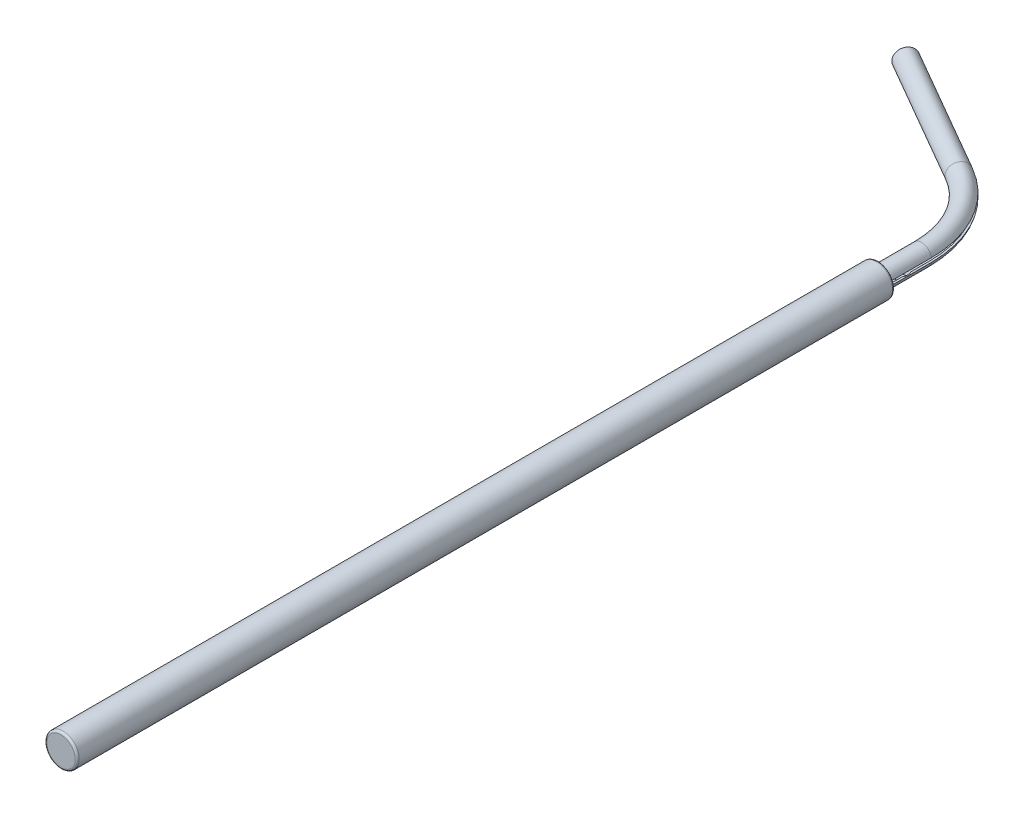
ISO-10303-21;
HEADER;
FILE_DESCRIPTION(('STEP AP214'),'2;1');
FILE_NAME('part.step','',(''),(''),'','','');
FILE_SCHEMA(('AUTOMOTIVE_DESIGN { 1 0 10303 214 1 1 1 1 }'));
ENDSEC;
DATA;
#1=APPLICATION_CONTEXT('core data for automotive mechanical design processes');
#2=APPLICATION_PROTOCOL_DEFINITION('international standard','automotive_design',2000,#1);
#3=PRODUCT_CONTEXT('',#1,'mechanical');
#4=PRODUCT('Part','Part','',(#3));
#5=PRODUCT_RELATED_PRODUCT_CATEGORY('part','',(#4));
#6=PRODUCT_DEFINITION_FORMATION('','',#4);
#7=PRODUCT_DEFINITION_CONTEXT('part definition',#1,'design');
#8=PRODUCT_DEFINITION('design','',#6,#7);
#9=PRODUCT_DEFINITION_SHAPE('','',#8);
#10=(LENGTH_UNIT() NAMED_UNIT(*) SI_UNIT(.MILLI.,.METRE.));
#11=(NAMED_UNIT(*) PLANE_ANGLE_UNIT() SI_UNIT($,.RADIAN.));
#12=(NAMED_UNIT(*) SI_UNIT($,.STERADIAN.) SOLID_ANGLE_UNIT());
#13=UNCERTAINTY_MEASURE_WITH_UNIT(LENGTH_MEASURE(1.E-05),#10,'distance_accuracy_value','');
#14=(GEOMETRIC_REPRESENTATION_CONTEXT(3) GLOBAL_UNCERTAINTY_ASSIGNED_CONTEXT((#13)) GLOBAL_UNIT_ASSIGNED_CONTEXT((#10,
#11,#12)) REPRESENTATION_CONTEXT('',''));
#15=CARTESIAN_POINT('',(0.,0.,0.));
#16=DIRECTION('',(0.,0.,1.));
#17=DIRECTION('',(1.,0.,0.));
#18=AXIS2_PLACEMENT_3D('',#15,#16,#17);
#19=CARTESIAN_POINT('',(0.,0.,-210.566243270259));
#20=DIRECTION('',(0.,0.,1.));
#21=DIRECTION('',(1.,0.,0.));
#22=AXIS2_PLACEMENT_3D('',#19,#20,#21);
#23=CYLINDRICAL_SURFACE('',#22,2.);
#24=DIRECTION('',(0.,0.,1.));
#25=VECTOR('',#24,1.);
#26=CARTESIAN_POINT('',(1.93649167310371,-0.499999999999999,-210.566243270259));
#27=LINE('',#26,#25);
#28=CARTESIAN_POINT('',(1.93649167310371,-0.5,-203.969223593596));
#29=VERTEX_POINT('',#28);
#30=CARTESIAN_POINT('',(1.93649167310371,-0.5,-200.));
#31=VERTEX_POINT('',#30);
#32=EDGE_CURVE('E127',#29,#31,#27,.T.);
#33=ORIENTED_EDGE('',*,*,#32,.F.);
#34=CARTESIAN_POINT('',(0.,0.,-203.969223593596));
#35=DIRECTION('',(0.,0.,-1.00000000000001));
#36=DIRECTION('',(-1.,0.,0.));
#37=AXIS2_PLACEMENT_3D('',#34,#35,#36);
#38=CIRCLE('',#37,2.);
#39=CARTESIAN_POINT('',(1.93649167310371,0.5,-203.969223593596));
#40=VERTEX_POINT('',#39);
#41=EDGE_CURVE('E47',#29,#40,#38,.T.);
#42=ORIENTED_EDGE('',*,*,#41,.T.);
#43=DIRECTION('',(0.,0.,1.));
#44=VECTOR('',#43,1.);
#45=CARTESIAN_POINT('',(1.93649167310371,0.5,-210.566243270259));
#46=LINE('',#45,#44);
#47=CARTESIAN_POINT('',(1.93649167310371,0.5,-200.));
#48=VERTEX_POINT('',#47);
#49=EDGE_CURVE('E126',#40,#48,#46,.T.);
#50=ORIENTED_EDGE('',*,*,#49,.T.);
#51=CARTESIAN_POINT('',(0.,0.,-200.));
#52=DIRECTION('',(0.,0.,1.));
#53=DIRECTION('',(-1.,0.,0.));
#54=AXIS2_PLACEMENT_3D('',#51,#52,#53);
#55=CIRCLE('',#54,2.);
#56=EDGE_CURVE('E262',#48,#31,#55,.T.);
#57=ORIENTED_EDGE('',*,*,#56,.T.);
#58=EDGE_LOOP('',(#33,#42,#50,#57));
#59=FACE_BOUND('',#58,.T.);
#60=ADVANCED_FACE('F32',(#59),#23,.F.);
#61=CARTESIAN_POINT('',(0.,0.,-200.));
#62=DIRECTION('',(0.,0.,1.));
#63=DIRECTION('',(1.,0.,0.));
#64=AXIS2_PLACEMENT_3D('',#61,#62,#63);
#65=PLANE('',#64);
#66=CARTESIAN_POINT('',(0.,0.,-200.));
#67=DIRECTION('',(0.,0.,1.));
#68=DIRECTION('',(1.,0.,0.));
#69=AXIS2_PLACEMENT_3D('',#66,#67,#68);
#70=CIRCLE('',#69,3.46075);
#71=CARTESIAN_POINT('',(3.46075,0.,-200.));
#72=VERTEX_POINT('',#71);
#73=EDGE_CURVE('E40',#72,#72,#70,.F.);
#74=ORIENTED_EDGE('',*,*,#73,.T.);
#75=EDGE_LOOP('',(#74));
#76=FACE_BOUND('',#75,.T.);
#77=CARTESIAN_POINT('',(0.,0.,-200.));
#78=DIRECTION('',(0.,0.,-1.));
#79=DIRECTION('',(-1.,0.,0.));
#80=AXIS2_PLACEMENT_3D('',#77,#78,#79);
#81=CIRCLE('',#80,2.5);
#82=CARTESIAN_POINT('',(2.44948974278318,-0.5,-200.));
#83=VERTEX_POINT('',#82);
#84=CARTESIAN_POINT('',(2.44948974278318,0.5,-200.));
#85=VERTEX_POINT('',#84);
#86=EDGE_CURVE('E54',#83,#85,#81,.T.);
#87=ORIENTED_EDGE('',*,*,#86,.F.);
#88=DIRECTION('',(1.,0.,0.));
#89=VECTOR('',#88,1.);
#90=CARTESIAN_POINT('',(1.93649167310371,-0.5,-200.));
#91=LINE('',#90,#89);
#92=EDGE_CURVE('E253',#31,#83,#91,.T.);
#93=ORIENTED_EDGE('',*,*,#92,.F.);
#94=ORIENTED_EDGE('',*,*,#56,.F.);
#95=DIRECTION('',(-1.,0.,0.));
#96=VECTOR('',#95,1.);
#97=CARTESIAN_POINT('',(2.44948974278318,0.5,-200.));
#98=LINE('',#97,#96);
#99=EDGE_CURVE('E258',#85,#48,#98,.T.);
#100=ORIENTED_EDGE('',*,*,#99,.F.);
#101=EDGE_LOOP('',(#87,#93,#94,#100));
#102=FACE_BOUND('',#101,.T.);
#103=ADVANCED_FACE('F188',(#76,#102),#65,.F.);
#104=CARTESIAN_POINT('',(0.,0.,-200.));
#105=DIRECTION('',(0.,0.,1.));
#106=DIRECTION('',(1.,0.,0.));
#107=AXIS2_PLACEMENT_3D('',#104,#105,#106);
#108=CYLINDRICAL_SURFACE('',#107,3.96875);
#109=CARTESIAN_POINT('',(0.,0.,-0.508000000000008));
#110=DIRECTION('',(0.,0.,1.));
#111=DIRECTION('',(1.,0.,0.));
#112=AXIS2_PLACEMENT_3D('',#109,#110,#111);
#113=CIRCLE('',#112,3.96875);
#114=CARTESIAN_POINT('',(3.96875,0.,-0.508000000000008));
#115=VERTEX_POINT('',#114);
#116=EDGE_CURVE('E183',#115,#115,#113,.F.);
#117=ORIENTED_EDGE('',*,*,#116,.T.);
#118=EDGE_LOOP('',(#117));
#119=FACE_BOUND('',#118,.T.);
#120=CARTESIAN_POINT('',(0.,0.,-199.492));
#121=DIRECTION('',(0.,0.,1.));
#122=DIRECTION('',(1.,0.,0.));
#123=AXIS2_PLACEMENT_3D('',#120,#121,#122);
#124=CIRCLE('',#123,3.96875);
#125=CARTESIAN_POINT('',(3.96875,0.,-199.492));
#126=VERTEX_POINT('',#125);
#127=EDGE_CURVE('E180',#126,#126,#124,.T.);
#128=ORIENTED_EDGE('',*,*,#127,.T.);
#129=EDGE_LOOP('',(#128));
#130=FACE_BOUND('',#129,.T.);
#131=ADVANCED_FACE('F196',(#119,#130),#108,.T.);
#132=CARTESIAN_POINT('',(0.,0.,0.));
#133=DIRECTION('',(0.,0.,1.));
#134=DIRECTION('',(1.,0.,0.));
#135=AXIS2_PLACEMENT_3D('',#132,#133,#134);
#136=PLANE('',#135);
#137=CARTESIAN_POINT('',(0.,0.,0.));
#138=DIRECTION('',(0.,0.,1.));
#139=DIRECTION('',(1.,0.,0.));
#140=AXIS2_PLACEMENT_3D('',#137,#138,#139);
#141=CIRCLE('',#140,3.46075);
#142=CARTESIAN_POINT('',(3.46075,0.,0.));
#143=VERTEX_POINT('',#142);
#144=EDGE_CURVE('E177',#143,#143,#141,.T.);
#145=ORIENTED_EDGE('',*,*,#144,.T.);
#146=EDGE_LOOP('',(#145));
#147=FACE_BOUND('',#146,.T.);
#148=ADVANCED_FACE('F198',(#147),#136,.T.);
#149=CARTESIAN_POINT('',(0.,0.,-0.508000000000008));
#150=DIRECTION('',(0.,0.,1.));
#151=DIRECTION('',(1.,0.,0.));
#152=AXIS2_PLACEMENT_3D('',#149,#150,#151);
#153=TOROIDAL_SURFACE('',#152,3.46075,0.508);
#154=ORIENTED_EDGE('',*,*,#116,.F.);
#155=EDGE_LOOP('',(#154));
#156=FACE_BOUND('',#155,.T.);
#157=ORIENTED_EDGE('',*,*,#144,.F.);
#158=EDGE_LOOP('',(#157));
#159=FACE_BOUND('',#158,.T.);
#160=ADVANCED_FACE('F193',(#156,#159),#153,.T.);
#161=CARTESIAN_POINT('',(0.,0.,-199.492));
#162=DIRECTION('',(0.,0.,1.));
#163=DIRECTION('',(1.,0.,0.));
#164=AXIS2_PLACEMENT_3D('',#161,#162,#163);
#165=TOROIDAL_SURFACE('',#164,3.46075,0.508);
#166=ORIENTED_EDGE('',*,*,#73,.F.);
#167=EDGE_LOOP('',(#166));
#168=FACE_BOUND('',#167,.T.);
#169=ORIENTED_EDGE('',*,*,#127,.F.);
#170=EDGE_LOOP('',(#169));
#171=FACE_BOUND('',#170,.T.);
#172=ADVANCED_FACE('F34',(#168,#171),#165,.T.);
#173=CARTESIAN_POINT('',(-12.5,0.,-232.21687836487));
#174=DIRECTION('',(-0.866025403784439,0.,-0.499999999999998));
#175=DIRECTION('',(-0.499999999999999,0.,0.86602540378444));
#176=AXIS2_PLACEMENT_3D('',#173,#174,#175);
#177=CYLINDRICAL_SURFACE('',#176,2.);
#178=CARTESIAN_POINT('',(-12.5,0.,-232.21687836487));
#179=DIRECTION('',(0.86602540378444,0.,0.499999999999998));
#180=DIRECTION('',(-0.499999999999998,0.,0.86602540378444));
#181=AXIS2_PLACEMENT_3D('',#178,#179,#180);
#182=CIRCLE('',#181,2.);
#183=CARTESIAN_POINT('',(-11.5317541634482,0.5,-233.893929347995));
#184=VERTEX_POINT('',#183);
#185=CARTESIAN_POINT('',(-11.5317541634482,-0.499999999999999,-233.893929347995));
#186=VERTEX_POINT('',#185);
#187=EDGE_CURVE('E140',#184,#186,#182,.T.);
#188=ORIENTED_EDGE('',*,*,#187,.T.);
#189=DIRECTION('',(-0.866025403784439,0.,-0.499999999999998));
#190=VECTOR('',#189,1.);
#191=CARTESIAN_POINT('',(-11.5317541634482,-0.499999999999999,-233.893929347995));
#192=LINE('',#191,#190);
#193=CARTESIAN_POINT('',(-42.3330243526703,-0.499999999999999,-251.677050983125));
#194=VERTEX_POINT('',#193);
#195=EDGE_CURVE('E168',#186,#194,#192,.T.);
#196=ORIENTED_EDGE('',*,*,#195,.T.);
#197=CARTESIAN_POINT('',(-43.3012701892222,0.,-250.));
#198=DIRECTION('',(0.86602540378444,0.,0.499999999999998));
#199=DIRECTION('',(-0.499999999999998,0.,0.86602540378444));
#200=AXIS2_PLACEMENT_3D('',#197,#198,#199);
#201=CIRCLE('',#200,2.);
#202=CARTESIAN_POINT('',(-42.3330243526703,0.5,-251.677050983125));
#203=VERTEX_POINT('',#202);
#204=EDGE_CURVE('E159',#203,#194,#201,.T.);
#205=ORIENTED_EDGE('',*,*,#204,.F.);
#206=DIRECTION('',(-0.866025403784439,0.,-0.499999999999998));
#207=VECTOR('',#206,1.);
#208=CARTESIAN_POINT('',(-11.5317541634482,0.5,-233.893929347995));
#209=LINE('',#208,#207);
#210=EDGE_CURVE('E171',#184,#203,#209,.T.);
#211=ORIENTED_EDGE('',*,*,#210,.F.);
#212=EDGE_LOOP('',(#188,#196,#205,#211));
#213=FACE_BOUND('',#212,.T.);
#214=ADVANCED_FACE('F192',(#213),#177,.F.);
#215=CARTESIAN_POINT('',(-12.5,0.,-232.21687836487));
#216=DIRECTION('',(-0.866025403784439,0.,-0.499999999999998));
#217=DIRECTION('',(-0.499999999999999,0.,0.86602540378444));
#218=AXIS2_PLACEMENT_3D('',#215,#216,#217);
#219=CYLINDRICAL_SURFACE('',#218,2.5);
#220=CARTESIAN_POINT('',(-12.5,0.,-232.21687836487));
#221=DIRECTION('',(-0.86602540378444,0.,-0.499999999999998));
#222=DIRECTION('',(-0.499999999999998,0.,0.86602540378444));
#223=AXIS2_PLACEMENT_3D('',#220,#221,#222);
#224=CIRCLE('',#223,2.5);
#225=CARTESIAN_POINT('',(-11.2752551286084,-0.5,-234.33819870843));
#226=VERTEX_POINT('',#225);
#227=CARTESIAN_POINT('',(-11.2752551286084,0.5,-234.33819870843));
#228=VERTEX_POINT('',#227);
#229=EDGE_CURVE('E137',#226,#228,#224,.T.);
#230=ORIENTED_EDGE('',*,*,#229,.T.);
#231=DIRECTION('',(-0.866025403784439,0.,-0.499999999999998));
#232=VECTOR('',#231,1.);
#233=CARTESIAN_POINT('',(-11.2752551286084,0.5,-234.33819870843));
#234=LINE('',#233,#232);
#235=CARTESIAN_POINT('',(-42.0765253178306,0.5,-252.12132034356));
#236=VERTEX_POINT('',#235);
#237=EDGE_CURVE('E174',#228,#236,#234,.T.);
#238=ORIENTED_EDGE('',*,*,#237,.T.);
#239=CARTESIAN_POINT('',(-43.3012701892222,0.,-250.));
#240=DIRECTION('',(-0.86602540378444,0.,-0.499999999999998));
#241=DIRECTION('',(-0.499999999999998,0.,0.86602540378444));
#242=AXIS2_PLACEMENT_3D('',#239,#240,#241);
#243=CIRCLE('',#242,2.5);
#244=CARTESIAN_POINT('',(-42.0765253178306,-0.5,-252.12132034356));
#245=VERTEX_POINT('',#244);
#246=EDGE_CURVE('E153',#245,#236,#243,.T.);
#247=ORIENTED_EDGE('',*,*,#246,.F.);
#248=DIRECTION('',(-0.866025403784439,0.,-0.499999999999998));
#249=VECTOR('',#248,1.);
#250=CARTESIAN_POINT('',(-11.2752551286084,-0.5,-234.33819870843));
#251=LINE('',#250,#249);
#252=EDGE_CURVE('E165',#226,#245,#251,.T.);
#253=ORIENTED_EDGE('',*,*,#252,.F.);
#254=EDGE_LOOP('',(#230,#238,#247,#253));
#255=FACE_BOUND('',#254,.T.);
#256=ADVANCED_FACE('F238',(#255),#219,.T.);
#257=CARTESIAN_POINT('',(-25.,0.,-210.566243270259));
#258=DIRECTION('',(0.,1.,0.));
#259=DIRECTION('',(0.,0.,1.));
#260=AXIS2_PLACEMENT_3D('',#257,#258,#259);
#261=TOROIDAL_SURFACE('',#260,25.,2.);
#262=CARTESIAN_POINT('',(0.,0.,-210.566243270259));
#263=DIRECTION('',(0.,0.,1.));
#264=DIRECTION('',(-1.,0.,0.));
#265=AXIS2_PLACEMENT_3D('',#262,#263,#264);
#266=CIRCLE('',#265,2.);
#267=CARTESIAN_POINT('',(1.93649167310371,0.5,-210.566243270259));
#268=VERTEX_POINT('',#267);
#269=CARTESIAN_POINT('',(1.93649167310371,-0.499999999999999,-210.566243270259));
#270=VERTEX_POINT('',#269);
#271=EDGE_CURVE('E248',#268,#270,#266,.T.);
#272=ORIENTED_EDGE('',*,*,#271,.T.);
#273=CARTESIAN_POINT('',(-25.,-0.499999999999999,-210.566243270259));
#274=DIRECTION('',(0.,1.,0.));
#275=DIRECTION('',(0.,0.,1.));
#276=AXIS2_PLACEMENT_3D('',#273,#274,#275);
#277=CIRCLE('',#276,26.9364916731037);
#278=EDGE_CURVE('E124',#270,#186,#277,.T.);
#279=ORIENTED_EDGE('',*,*,#278,.T.);
#280=ORIENTED_EDGE('',*,*,#187,.F.);
#281=CARTESIAN_POINT('',(-25.,0.5,-210.566243270259));
#282=DIRECTION('',(0.,1.,0.));
#283=DIRECTION('',(0.,0.,1.));
#284=AXIS2_PLACEMENT_3D('',#281,#282,#283);
#285=CIRCLE('',#284,26.9364916731037);
#286=EDGE_CURVE('E147',#268,#184,#285,.T.);
#287=ORIENTED_EDGE('',*,*,#286,.F.);
#288=EDGE_LOOP('',(#272,#279,#280,#287));
#289=FACE_BOUND('',#288,.T.);
#290=ADVANCED_FACE('F234',(#289),#261,.F.);
#291=CARTESIAN_POINT('',(-25.,0.,-210.566243270259));
#292=DIRECTION('',(0.,1.,0.));
#293=DIRECTION('',(0.,0.,1.));
#294=AXIS2_PLACEMENT_3D('',#291,#292,#293);
#295=TOROIDAL_SURFACE('',#294,25.,2.5);
#296=CARTESIAN_POINT('',(0.,0.,-210.566243270259));
#297=DIRECTION('',(0.,0.,-1.));
#298=DIRECTION('',(-1.,0.,0.));
#299=AXIS2_PLACEMENT_3D('',#296,#297,#298);
#300=CIRCLE('',#299,2.5);
#301=CARTESIAN_POINT('',(2.44948974278318,-0.5,-210.566243270259));
#302=VERTEX_POINT('',#301);
#303=CARTESIAN_POINT('',(2.44948974278318,0.5,-210.566243270259));
#304=VERTEX_POINT('',#303);
#305=EDGE_CURVE('E249',#302,#304,#300,.T.);
#306=ORIENTED_EDGE('',*,*,#305,.T.);
#307=CARTESIAN_POINT('',(-25.,0.5,-210.566243270259));
#308=DIRECTION('',(0.,1.,0.));
#309=DIRECTION('',(0.,0.,1.));
#310=AXIS2_PLACEMENT_3D('',#307,#308,#309);
#311=CIRCLE('',#310,27.4494897427832);
#312=EDGE_CURVE('E150',#304,#228,#311,.T.);
#313=ORIENTED_EDGE('',*,*,#312,.T.);
#314=ORIENTED_EDGE('',*,*,#229,.F.);
#315=CARTESIAN_POINT('',(-25.,-0.5,-210.566243270259));
#316=DIRECTION('',(0.,1.,0.));
#317=DIRECTION('',(0.,0.,1.));
#318=AXIS2_PLACEMENT_3D('',#315,#316,#317);
#319=CIRCLE('',#318,27.4494897427832);
#320=EDGE_CURVE('E143',#302,#226,#319,.T.);
#321=ORIENTED_EDGE('',*,*,#320,.F.);
#322=EDGE_LOOP('',(#306,#313,#314,#321));
#323=FACE_BOUND('',#322,.T.);
#324=ADVANCED_FACE('F227',(#323),#295,.T.);
#325=CARTESIAN_POINT('',(0.,0.,-210.566243270259));
#326=DIRECTION('',(0.,0.,1.));
#327=DIRECTION('',(1.,0.,0.));
#328=AXIS2_PLACEMENT_3D('',#325,#326,#327);
#329=CYLINDRICAL_SURFACE('',#328,2.5);
#330=ORIENTED_EDGE('',*,*,#86,.T.);
#331=DIRECTION('',(0.,0.,1.));
#332=VECTOR('',#331,1.);
#333=CARTESIAN_POINT('',(2.44948974278318,0.5,-210.566243270259));
#334=LINE('',#333,#332);
#335=EDGE_CURVE('E134',#304,#85,#334,.T.);
#336=ORIENTED_EDGE('',*,*,#335,.F.);
#337=ORIENTED_EDGE('',*,*,#305,.F.);
#338=DIRECTION('',(0.,0.,1.));
#339=VECTOR('',#338,1.);
#340=CARTESIAN_POINT('',(2.44948974278318,-0.5,-210.566243270259));
#341=LINE('',#340,#339);
#342=EDGE_CURVE('E130',#302,#83,#341,.T.);
#343=ORIENTED_EDGE('',*,*,#342,.T.);
#344=EDGE_LOOP('',(#330,#336,#337,#343));
#345=FACE_BOUND('',#344,.T.);
#346=ADVANCED_FACE('F222',(#345),#329,.T.);
#347=CARTESIAN_POINT('',(2.44948974278318,0.5,-210.566243270259));
#348=DIRECTION('',(0.,1.,0.));
#349=DIRECTION('',(-1.,0.,0.));
#350=AXIS2_PLACEMENT_3D('',#347,#348,#349);
#351=PLANE('',#350);
#352=ORIENTED_EDGE('',*,*,#49,.F.);
#353=CARTESIAN_POINT('',(0.,0.499999999999999,-205.));
#354=DIRECTION('',(0.,1.,0.));
#355=DIRECTION('',(-1.,0.,0.));
#356=AXIS2_PLACEMENT_3D('',#353,#354,#355);
#357=CIRCLE('',#356,2.19374109684803);
#358=CARTESIAN_POINT('',(1.93649167310371,0.5,-206.030776406404));
#359=VERTEX_POINT('',#358);
#360=EDGE_CURVE('E259',#40,#359,#357,.T.);
#361=ORIENTED_EDGE('',*,*,#360,.T.);
#362=EDGE_CURVE('E120',#268,#359,#46,.T.);
#363=ORIENTED_EDGE('',*,*,#362,.F.);
#364=ORIENTED_EDGE('',*,*,#286,.T.);
#365=ORIENTED_EDGE('',*,*,#210,.T.);
#366=DIRECTION('',(-0.499999999999998,0.,0.86602540378444));
#367=VECTOR('',#366,1.);
#368=CARTESIAN_POINT('',(-42.0765253178306,0.5,-252.12132034356));
#369=LINE('',#368,#367);
#370=EDGE_CURVE('E162',#236,#203,#369,.T.);
#371=ORIENTED_EDGE('',*,*,#370,.F.);
#372=ORIENTED_EDGE('',*,*,#237,.F.);
#373=ORIENTED_EDGE('',*,*,#312,.F.);
#374=ORIENTED_EDGE('',*,*,#335,.T.);
#375=ORIENTED_EDGE('',*,*,#99,.T.);
#376=EDGE_LOOP('',(#352,#361,#363,#364,#365,#371,#372,#373,#374,#375));
#377=FACE_BOUND('',#376,.T.);
#378=ADVANCED_FACE('F216',(#377),#351,.F.);
#379=ORIENTED_EDGE('',*,*,#362,.T.);
#380=CARTESIAN_POINT('',(0.,0.,-206.030776406404));
#381=DIRECTION('',(0.,0.,1.00000000000001));
#382=DIRECTION('',(1.,0.,0.));
#383=AXIS2_PLACEMENT_3D('',#380,#381,#382);
#384=CIRCLE('',#383,2.);
#385=CARTESIAN_POINT('',(1.93649167310371,-0.5,-206.030776406404));
#386=VERTEX_POINT('',#385);
#387=EDGE_CURVE('E108',#359,#386,#384,.T.);
#388=ORIENTED_EDGE('',*,*,#387,.T.);
#389=EDGE_CURVE('E118',#270,#386,#27,.T.);
#390=ORIENTED_EDGE('',*,*,#389,.F.);
#391=ORIENTED_EDGE('',*,*,#271,.F.);
#392=EDGE_LOOP('',(#379,#388,#390,#391));
#393=FACE_BOUND('',#392,.T.);
#394=ADVANCED_FACE('F116',(#393),#23,.F.);
#395=CARTESIAN_POINT('',(1.93649167310371,-0.5,-210.566243270259));
#396=DIRECTION('',(0.,-1.,0.));
#397=DIRECTION('',(1.,0.,0.));
#398=AXIS2_PLACEMENT_3D('',#395,#396,#397);
#399=PLANE('',#398);
#400=ORIENTED_EDGE('',*,*,#389,.T.);
#401=CARTESIAN_POINT('',(0.,-0.499999999999999,-205.));
#402=DIRECTION('',(0.,-1.,0.));
#403=DIRECTION('',(1.,0.,0.));
#404=AXIS2_PLACEMENT_3D('',#401,#402,#403);
#405=CIRCLE('',#404,2.19374109684803);
#406=EDGE_CURVE('E11',#386,#29,#405,.T.);
#407=ORIENTED_EDGE('',*,*,#406,.T.);
#408=ORIENTED_EDGE('',*,*,#32,.T.);
#409=ORIENTED_EDGE('',*,*,#92,.T.);
#410=ORIENTED_EDGE('',*,*,#342,.F.);
#411=ORIENTED_EDGE('',*,*,#320,.T.);
#412=ORIENTED_EDGE('',*,*,#252,.T.);
#413=DIRECTION('',(0.499999999999998,0.,-0.86602540378444));
#414=VECTOR('',#413,1.);
#415=CARTESIAN_POINT('',(-42.3330243526703,-0.5,-251.677050983125));
#416=LINE('',#415,#414);
#417=EDGE_CURVE('E156',#194,#245,#416,.T.);
#418=ORIENTED_EDGE('',*,*,#417,.F.);
#419=ORIENTED_EDGE('',*,*,#195,.F.);
#420=ORIENTED_EDGE('',*,*,#278,.F.);
#421=EDGE_LOOP('',(#400,#407,#408,#409,#410,#411,#412,#418,#419,#420));
#422=FACE_BOUND('',#421,.T.);
#423=ADVANCED_FACE('F122',(#422),#399,.F.);
#424=CARTESIAN_POINT('',(-43.3012701892222,0.,-250.));
#425=DIRECTION('',(-0.86602540378444,0.,-0.499999999999998));
#426=DIRECTION('',(-0.499999999999998,0.,0.86602540378444));
#427=AXIS2_PLACEMENT_3D('',#424,#425,#426);
#428=PLANE('',#427);
#429=ORIENTED_EDGE('',*,*,#246,.T.);
#430=ORIENTED_EDGE('',*,*,#370,.T.);
#431=ORIENTED_EDGE('',*,*,#204,.T.);
#432=ORIENTED_EDGE('',*,*,#417,.T.);
#433=EDGE_LOOP('',(#429,#430,#431,#432));
#434=FACE_BOUND('',#433,.T.);
#435=ADVANCED_FACE('F221',(#434),#428,.T.);
#436=CARTESIAN_POINT('',(0.,0.,-205.));
#437=DIRECTION('',(0.,-1.,0.));
#438=DIRECTION('',(1.,0.,0.));
#439=AXIS2_PLACEMENT_3D('',#436,#437,#438);
#440=SPHERICAL_SURFACE('',#439,2.25);
#441=ORIENTED_EDGE('',*,*,#41,.F.);
#442=ORIENTED_EDGE('',*,*,#406,.F.);
#443=ORIENTED_EDGE('',*,*,#387,.F.);
#444=ORIENTED_EDGE('',*,*,#360,.F.);
#445=EDGE_LOOP('',(#441,#442,#443,#444));
#446=FACE_BOUND('',#445,.T.);
#447=ADVANCED_FACE('F107',(#446),#440,.F.);
#448=CLOSED_SHELL('',(#60,#103,#131,#148,#160,#172,#214,#256,#290,#324,#346,#378,#394,#423,#435,#447));
#449=MANIFOLD_SOLID_BREP('B2',#448);
#450=ADVANCED_BREP_SHAPE_REPRESENTATION('',(#18,#449),#14);
#451=SHAPE_DEFINITION_REPRESENTATION(#9,#450);
ENDSEC;
END-ISO-10303-21;
